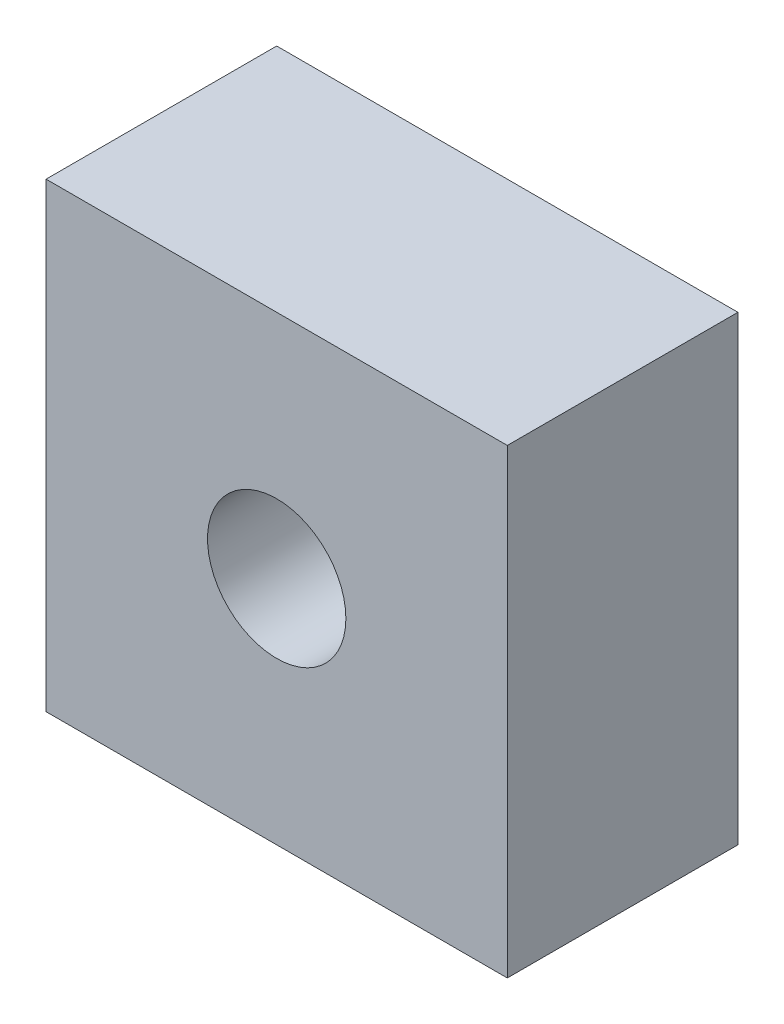
ISO-10303-21;
HEADER;
FILE_DESCRIPTION(('STEP AP214'),'2;1');
FILE_NAME('part.step','',(''),(''),'','','');
FILE_SCHEMA(('AUTOMOTIVE_DESIGN { 1 0 10303 214 1 1 1 1 }'));
ENDSEC;
DATA;
#1=APPLICATION_CONTEXT('core data for automotive mechanical design processes');
#2=APPLICATION_PROTOCOL_DEFINITION('international standard','automotive_design',2000,#1);
#3=PRODUCT_CONTEXT('',#1,'mechanical');
#4=PRODUCT('Part','Part','',(#3));
#5=PRODUCT_RELATED_PRODUCT_CATEGORY('part','',(#4));
#6=PRODUCT_DEFINITION_FORMATION('','',#4);
#7=PRODUCT_DEFINITION_CONTEXT('part definition',#1,'design');
#8=PRODUCT_DEFINITION('design','',#6,#7);
#9=PRODUCT_DEFINITION_SHAPE('','',#8);
#10=(LENGTH_UNIT() NAMED_UNIT(*) SI_UNIT(.MILLI.,.METRE.));
#11=(NAMED_UNIT(*) PLANE_ANGLE_UNIT() SI_UNIT($,.RADIAN.));
#12=(NAMED_UNIT(*) SI_UNIT($,.STERADIAN.) SOLID_ANGLE_UNIT());
#13=UNCERTAINTY_MEASURE_WITH_UNIT(LENGTH_MEASURE(1.E-05),#10,'distance_accuracy_value','');
#14=(GEOMETRIC_REPRESENTATION_CONTEXT(3) GLOBAL_UNCERTAINTY_ASSIGNED_CONTEXT((#13)) GLOBAL_UNIT_ASSIGNED_CONTEXT((#10,
#11,#12)) REPRESENTATION_CONTEXT('',''));
#15=CARTESIAN_POINT('',(0.,0.,0.));
#16=DIRECTION('',(0.,0.,1.));
#17=DIRECTION('',(1.,0.,0.));
#18=AXIS2_PLACEMENT_3D('',#15,#16,#17);
#19=CARTESIAN_POINT('',(0.,0.,5.));
#20=DIRECTION('',(0.,0.,-1.));
#21=DIRECTION('',(-1.,0.,0.));
#22=AXIS2_PLACEMENT_3D('',#19,#20,#21);
#23=PLANE('',#22);
#24=DIRECTION('',(0.,1.,0.));
#25=VECTOR('',#24,1.);
#26=CARTESIAN_POINT('',(5.,-5.,5.));
#27=LINE('',#26,#25);
#28=CARTESIAN_POINT('',(5.,-5.,5.));
#29=VERTEX_POINT('',#28);
#30=CARTESIAN_POINT('',(5.,5.,5.));
#31=VERTEX_POINT('',#30);
#32=EDGE_CURVE('E93',#29,#31,#27,.T.);
#33=ORIENTED_EDGE('',*,*,#32,.T.);
#34=DIRECTION('',(-1.,0.,0.));
#35=VECTOR('',#34,1.);
#36=CARTESIAN_POINT('',(-5.,5.,5.));
#37=LINE('',#36,#35);
#38=CARTESIAN_POINT('',(-5.,5.,5.));
#39=VERTEX_POINT('',#38);
#40=EDGE_CURVE('E88',#31,#39,#37,.T.);
#41=ORIENTED_EDGE('',*,*,#40,.T.);
#42=DIRECTION('',(0.,-1.,0.));
#43=VECTOR('',#42,1.);
#44=CARTESIAN_POINT('',(-5.,-5.,5.));
#45=LINE('',#44,#43);
#46=CARTESIAN_POINT('',(-5.,-5.,5.));
#47=VERTEX_POINT('',#46);
#48=EDGE_CURVE('E91',#39,#47,#45,.T.);
#49=ORIENTED_EDGE('',*,*,#48,.T.);
#50=DIRECTION('',(1.,0.,0.));
#51=VECTOR('',#50,1.);
#52=CARTESIAN_POINT('',(-5.,-5.,5.));
#53=LINE('',#52,#51);
#54=EDGE_CURVE('E58',#47,#29,#53,.T.);
#55=ORIENTED_EDGE('',*,*,#54,.T.);
#56=EDGE_LOOP('',(#33,#41,#49,#55));
#57=FACE_BOUND('',#56,.T.);
#58=CARTESIAN_POINT('',(0.,0.,5.));
#59=DIRECTION('',(0.,0.,1.));
#60=DIRECTION('',(1.,0.,0.));
#61=AXIS2_PLACEMENT_3D('',#58,#59,#60);
#62=CIRCLE('',#61,1.5);
#63=CARTESIAN_POINT('',(1.5,0.,5.));
#64=VERTEX_POINT('',#63);
#65=EDGE_CURVE('E121',#64,#64,#62,.T.);
#66=ORIENTED_EDGE('',*,*,#65,.F.);
#67=EDGE_LOOP('',(#66));
#68=FACE_BOUND('',#67,.T.);
#69=ADVANCED_FACE('F40',(#57,#68),#23,.F.);
#70=CARTESIAN_POINT('',(0.,0.,0.));
#71=DIRECTION('',(0.,0.,-1.));
#72=DIRECTION('',(-1.,0.,0.));
#73=AXIS2_PLACEMENT_3D('',#70,#71,#72);
#74=PLANE('',#73);
#75=DIRECTION('',(0.,1.,0.));
#76=VECTOR('',#75,1.);
#77=CARTESIAN_POINT('',(5.,-5.,0.));
#78=LINE('',#77,#76);
#79=CARTESIAN_POINT('',(5.,-5.,0.));
#80=VERTEX_POINT('',#79);
#81=CARTESIAN_POINT('',(5.,5.,0.));
#82=VERTEX_POINT('',#81);
#83=EDGE_CURVE('E125',#80,#82,#78,.T.);
#84=ORIENTED_EDGE('',*,*,#83,.F.);
#85=DIRECTION('',(1.,0.,0.));
#86=VECTOR('',#85,1.);
#87=CARTESIAN_POINT('',(-5.,-5.,0.));
#88=LINE('',#87,#86);
#89=CARTESIAN_POINT('',(-5.,-5.,0.));
#90=VERTEX_POINT('',#89);
#91=EDGE_CURVE('E81',#90,#80,#88,.T.);
#92=ORIENTED_EDGE('',*,*,#91,.F.);
#93=DIRECTION('',(0.,-1.,0.));
#94=VECTOR('',#93,1.);
#95=CARTESIAN_POINT('',(-5.,-5.,0.));
#96=LINE('',#95,#94);
#97=CARTESIAN_POINT('',(-5.,5.,0.));
#98=VERTEX_POINT('',#97);
#99=EDGE_CURVE('E75',#98,#90,#96,.T.);
#100=ORIENTED_EDGE('',*,*,#99,.F.);
#101=DIRECTION('',(-1.,0.,0.));
#102=VECTOR('',#101,1.);
#103=CARTESIAN_POINT('',(-5.,5.,0.));
#104=LINE('',#103,#102);
#105=EDGE_CURVE('E98',#82,#98,#104,.T.);
#106=ORIENTED_EDGE('',*,*,#105,.F.);
#107=EDGE_LOOP('',(#84,#92,#100,#106));
#108=FACE_BOUND('',#107,.T.);
#109=CARTESIAN_POINT('',(0.,0.,0.));
#110=DIRECTION('',(0.,0.,1.));
#111=DIRECTION('',(1.,0.,0.));
#112=AXIS2_PLACEMENT_3D('',#109,#110,#111);
#113=CIRCLE('',#112,1.5);
#114=CARTESIAN_POINT('',(1.5,0.,0.));
#115=VERTEX_POINT('',#114);
#116=EDGE_CURVE('E118',#115,#115,#113,.T.);
#117=ORIENTED_EDGE('',*,*,#116,.T.);
#118=EDGE_LOOP('',(#117));
#119=FACE_BOUND('',#118,.T.);
#120=ADVANCED_FACE('F144',(#108,#119),#74,.T.);
#121=CARTESIAN_POINT('',(5.,-5.,5.));
#122=DIRECTION('',(-1.,0.,0.));
#123=DIRECTION('',(0.,0.,1.));
#124=AXIS2_PLACEMENT_3D('',#121,#122,#123);
#125=PLANE('',#124);
#126=ORIENTED_EDGE('',*,*,#83,.T.);
#127=DIRECTION('',(0.,0.,-1.));
#128=VECTOR('',#127,1.);
#129=CARTESIAN_POINT('',(5.,5.,5.));
#130=LINE('',#129,#128);
#131=EDGE_CURVE('E12',#31,#82,#130,.T.);
#132=ORIENTED_EDGE('',*,*,#131,.F.);
#133=ORIENTED_EDGE('',*,*,#32,.F.);
#134=DIRECTION('',(0.,0.,-1.));
#135=VECTOR('',#134,1.);
#136=CARTESIAN_POINT('',(5.,-5.,5.));
#137=LINE('',#136,#135);
#138=EDGE_CURVE('E105',#29,#80,#137,.T.);
#139=ORIENTED_EDGE('',*,*,#138,.T.);
#140=EDGE_LOOP('',(#126,#132,#133,#139));
#141=FACE_BOUND('',#140,.T.);
#142=ADVANCED_FACE('F42',(#141),#125,.F.);
#143=CARTESIAN_POINT('',(-5.,5.,5.));
#144=DIRECTION('',(0.,-1.,0.));
#145=DIRECTION('',(0.,0.,-1.));
#146=AXIS2_PLACEMENT_3D('',#143,#144,#145);
#147=PLANE('',#146);
#148=ORIENTED_EDGE('',*,*,#105,.T.);
#149=DIRECTION('',(0.,0.,-1.));
#150=VECTOR('',#149,1.);
#151=CARTESIAN_POINT('',(-5.,5.,5.));
#152=LINE('',#151,#150);
#153=EDGE_CURVE('E50',#39,#98,#152,.T.);
#154=ORIENTED_EDGE('',*,*,#153,.F.);
#155=ORIENTED_EDGE('',*,*,#40,.F.);
#156=ORIENTED_EDGE('',*,*,#131,.T.);
#157=EDGE_LOOP('',(#148,#154,#155,#156));
#158=FACE_BOUND('',#157,.T.);
#159=ADVANCED_FACE('F97',(#158),#147,.F.);
#160=CARTESIAN_POINT('',(-5.,-5.,5.));
#161=DIRECTION('',(1.,0.,0.));
#162=DIRECTION('',(0.,0.,-1.));
#163=AXIS2_PLACEMENT_3D('',#160,#161,#162);
#164=PLANE('',#163);
#165=ORIENTED_EDGE('',*,*,#99,.T.);
#166=DIRECTION('',(0.,0.,-1.));
#167=VECTOR('',#166,1.);
#168=CARTESIAN_POINT('',(-5.,-5.,5.));
#169=LINE('',#168,#167);
#170=EDGE_CURVE('E100',#47,#90,#169,.T.);
#171=ORIENTED_EDGE('',*,*,#170,.F.);
#172=ORIENTED_EDGE('',*,*,#48,.F.);
#173=ORIENTED_EDGE('',*,*,#153,.T.);
#174=EDGE_LOOP('',(#165,#171,#172,#173));
#175=FACE_BOUND('',#174,.T.);
#176=ADVANCED_FACE('F101',(#175),#164,.F.);
#177=CARTESIAN_POINT('',(-5.,-5.,5.));
#178=DIRECTION('',(0.,1.,0.));
#179=DIRECTION('',(0.,0.,1.));
#180=AXIS2_PLACEMENT_3D('',#177,#178,#179);
#181=PLANE('',#180);
#182=ORIENTED_EDGE('',*,*,#91,.T.);
#183=ORIENTED_EDGE('',*,*,#138,.F.);
#184=ORIENTED_EDGE('',*,*,#54,.F.);
#185=ORIENTED_EDGE('',*,*,#170,.T.);
#186=EDGE_LOOP('',(#182,#183,#184,#185));
#187=FACE_BOUND('',#186,.T.);
#188=ADVANCED_FACE('F142',(#187),#181,.F.);
#189=CARTESIAN_POINT('',(0.,0.,5.));
#190=DIRECTION('',(0.,0.,-1.));
#191=DIRECTION('',(-1.,0.,0.));
#192=AXIS2_PLACEMENT_3D('',#189,#190,#191);
#193=CYLINDRICAL_SURFACE('',#192,1.5);
#194=ORIENTED_EDGE('',*,*,#65,.T.);
#195=EDGE_LOOP('',(#194));
#196=FACE_BOUND('',#195,.T.);
#197=ORIENTED_EDGE('',*,*,#116,.F.);
#198=EDGE_LOOP('',(#197));
#199=FACE_BOUND('',#198,.T.);
#200=ADVANCED_FACE('F157',(#196,#199),#193,.F.);
#201=CLOSED_SHELL('',(#69,#120,#142,#159,#176,#188,#200));
#202=MANIFOLD_SOLID_BREP('B2',#201);
#203=ADVANCED_BREP_SHAPE_REPRESENTATION('',(#18,#202),#14);
#204=SHAPE_DEFINITION_REPRESENTATION(#9,#203);
ENDSEC;
END-ISO-10303-21;
